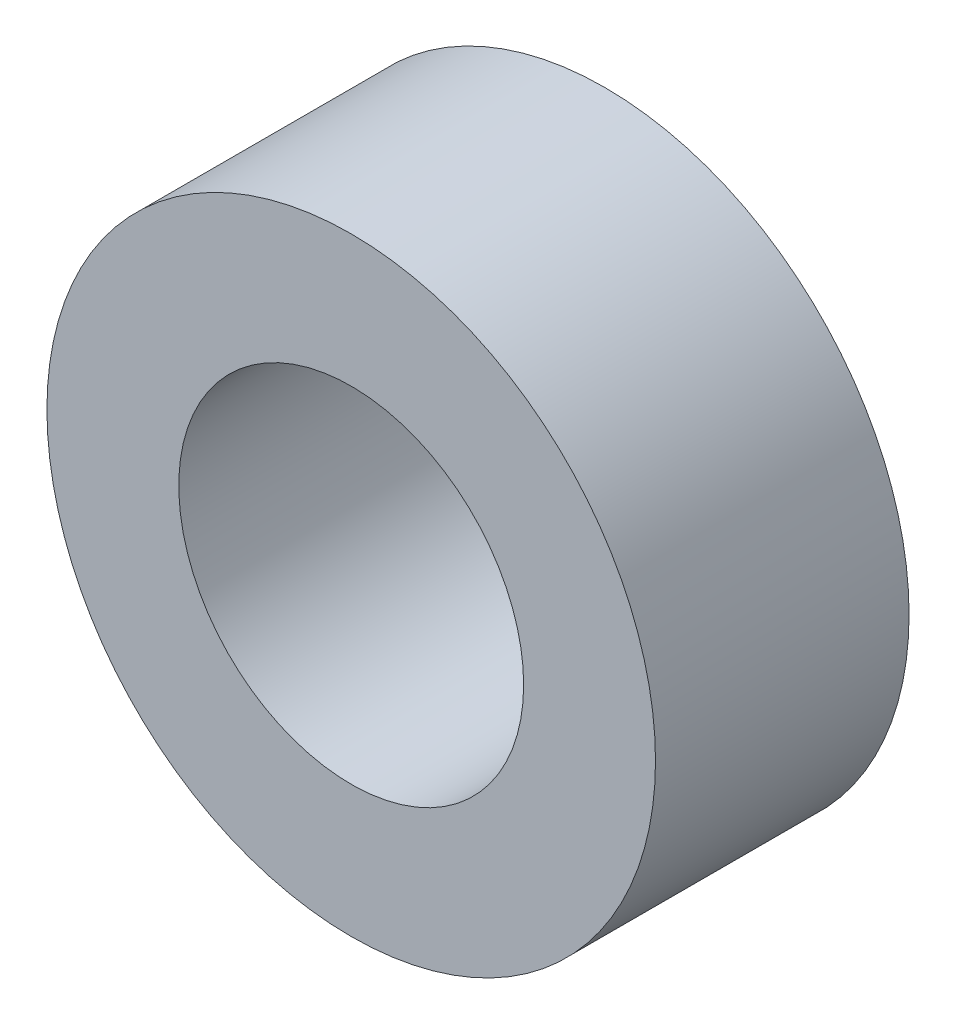
ISO-10303-21;
HEADER;
FILE_DESCRIPTION(('STEP AP214'),'2;1');
FILE_NAME('part.step','',(''),(''),'','','');
FILE_SCHEMA(('AUTOMOTIVE_DESIGN { 1 0 10303 214 1 1 1 1 }'));
ENDSEC;
DATA;
#1=APPLICATION_CONTEXT('core data for automotive mechanical design processes');
#2=APPLICATION_PROTOCOL_DEFINITION('international standard','automotive_design',2000,#1);
#3=PRODUCT_CONTEXT('',#1,'mechanical');
#4=PRODUCT('Part','Part','',(#3));
#5=PRODUCT_RELATED_PRODUCT_CATEGORY('part','',(#4));
#6=PRODUCT_DEFINITION_FORMATION('','',#4);
#7=PRODUCT_DEFINITION_CONTEXT('part definition',#1,'design');
#8=PRODUCT_DEFINITION('design','',#6,#7);
#9=PRODUCT_DEFINITION_SHAPE('','',#8);
#10=(LENGTH_UNIT() NAMED_UNIT(*) SI_UNIT(.MILLI.,.METRE.));
#11=(NAMED_UNIT(*) PLANE_ANGLE_UNIT() SI_UNIT($,.RADIAN.));
#12=(NAMED_UNIT(*) SI_UNIT($,.STERADIAN.) SOLID_ANGLE_UNIT());
#13=UNCERTAINTY_MEASURE_WITH_UNIT(LENGTH_MEASURE(1.E-05),#10,'distance_accuracy_value','');
#14=(GEOMETRIC_REPRESENTATION_CONTEXT(3) GLOBAL_UNCERTAINTY_ASSIGNED_CONTEXT((#13)) GLOBAL_UNIT_ASSIGNED_CONTEXT((#10,
#11,#12)) REPRESENTATION_CONTEXT('',''));
#15=CARTESIAN_POINT('',(0.,0.,0.));
#16=DIRECTION('',(0.,0.,1.));
#17=DIRECTION('',(1.,0.,0.));
#18=AXIS2_PLACEMENT_3D('',#15,#16,#17);
#19=CARTESIAN_POINT('',(188.5,-40.5,94.));
#20=DIRECTION('',(0.,0.,1.));
#21=DIRECTION('',(1.,0.,0.));
#22=AXIS2_PLACEMENT_3D('',#19,#20,#21);
#23=CYLINDRICAL_SURFACE('',#22,3.);
#24=CARTESIAN_POINT('',(188.5,-40.5,94.));
#25=DIRECTION('',(0.,0.,1.));
#26=DIRECTION('',(1.,0.,0.));
#27=AXIS2_PLACEMENT_3D('',#24,#25,#26);
#28=CIRCLE('',#27,3.);
#29=CARTESIAN_POINT('',(191.5,-40.5,94.));
#30=VERTEX_POINT('',#29);
#31=EDGE_CURVE('E10',#30,#30,#28,.T.);
#32=ORIENTED_EDGE('',*,*,#31,.T.);
#33=EDGE_LOOP('',(#32));
#34=FACE_BOUND('',#33,.T.);
#35=CARTESIAN_POINT('',(188.5,-40.5,96.5));
#36=DIRECTION('',(0.,0.,1.));
#37=DIRECTION('',(1.,0.,0.));
#38=AXIS2_PLACEMENT_3D('',#35,#36,#37);
#39=CIRCLE('',#38,3.);
#40=CARTESIAN_POINT('',(191.5,-40.5,96.5));
#41=VERTEX_POINT('',#40);
#42=EDGE_CURVE('E45',#41,#41,#39,.T.);
#43=ORIENTED_EDGE('',*,*,#42,.F.);
#44=EDGE_LOOP('',(#43));
#45=FACE_BOUND('',#44,.T.);
#46=ADVANCED_FACE('F39',(#34,#45),#23,.T.);
#47=CARTESIAN_POINT('',(188.5,-40.5,94.));
#48=DIRECTION('',(0.,0.,1.));
#49=DIRECTION('',(1.,0.,0.));
#50=AXIS2_PLACEMENT_3D('',#47,#48,#49);
#51=PLANE('',#50);
#52=CARTESIAN_POINT('',(188.5,-40.5,94.));
#53=DIRECTION('',(0.,0.,1.));
#54=DIRECTION('',(1.,0.,0.));
#55=AXIS2_PLACEMENT_3D('',#52,#53,#54);
#56=CIRCLE('',#55,1.70000000000001);
#57=CARTESIAN_POINT('',(190.2,-40.5,94.));
#58=VERTEX_POINT('',#57);
#59=EDGE_CURVE('E47',#58,#58,#56,.T.);
#60=ORIENTED_EDGE('',*,*,#59,.T.);
#61=EDGE_LOOP('',(#60));
#62=FACE_BOUND('',#61,.T.);
#63=ORIENTED_EDGE('',*,*,#31,.F.);
#64=EDGE_LOOP('',(#63));
#65=FACE_BOUND('',#64,.T.);
#66=ADVANCED_FACE('F60',(#62,#65),#51,.F.);
#67=CARTESIAN_POINT('',(188.5,-40.5,96.5));
#68=DIRECTION('',(0.,0.,1.));
#69=DIRECTION('',(1.,0.,0.));
#70=AXIS2_PLACEMENT_3D('',#67,#68,#69);
#71=PLANE('',#70);
#72=CARTESIAN_POINT('',(188.5,-40.5,96.5));
#73=DIRECTION('',(0.,0.,1.));
#74=DIRECTION('',(1.,0.,0.));
#75=AXIS2_PLACEMENT_3D('',#72,#73,#74);
#76=CIRCLE('',#75,1.70000000000001);
#77=CARTESIAN_POINT('',(190.2,-40.5,96.5));
#78=VERTEX_POINT('',#77);
#79=EDGE_CURVE('E51',#78,#78,#76,.T.);
#80=ORIENTED_EDGE('',*,*,#79,.F.);
#81=EDGE_LOOP('',(#80));
#82=FACE_BOUND('',#81,.T.);
#83=ORIENTED_EDGE('',*,*,#42,.T.);
#84=EDGE_LOOP('',(#83));
#85=FACE_BOUND('',#84,.T.);
#86=ADVANCED_FACE('F64',(#82,#85),#71,.T.);
#87=CARTESIAN_POINT('',(188.5,-40.5,94.));
#88=DIRECTION('',(0.,0.,1.));
#89=DIRECTION('',(1.,0.,0.));
#90=AXIS2_PLACEMENT_3D('',#87,#88,#89);
#91=CYLINDRICAL_SURFACE('',#90,1.70000000000001);
#92=ORIENTED_EDGE('',*,*,#59,.F.);
#93=EDGE_LOOP('',(#92));
#94=FACE_BOUND('',#93,.T.);
#95=ORIENTED_EDGE('',*,*,#79,.T.);
#96=EDGE_LOOP('',(#95));
#97=FACE_BOUND('',#96,.T.);
#98=ADVANCED_FACE('F58',(#94,#97),#91,.F.);
#99=CLOSED_SHELL('',(#46,#66,#86,#98));
#100=MANIFOLD_SOLID_BREP('B2',#99);
#101=ADVANCED_BREP_SHAPE_REPRESENTATION('',(#18,#100),#14);
#102=SHAPE_DEFINITION_REPRESENTATION(#9,#101);
ENDSEC;
END-ISO-10303-21;
